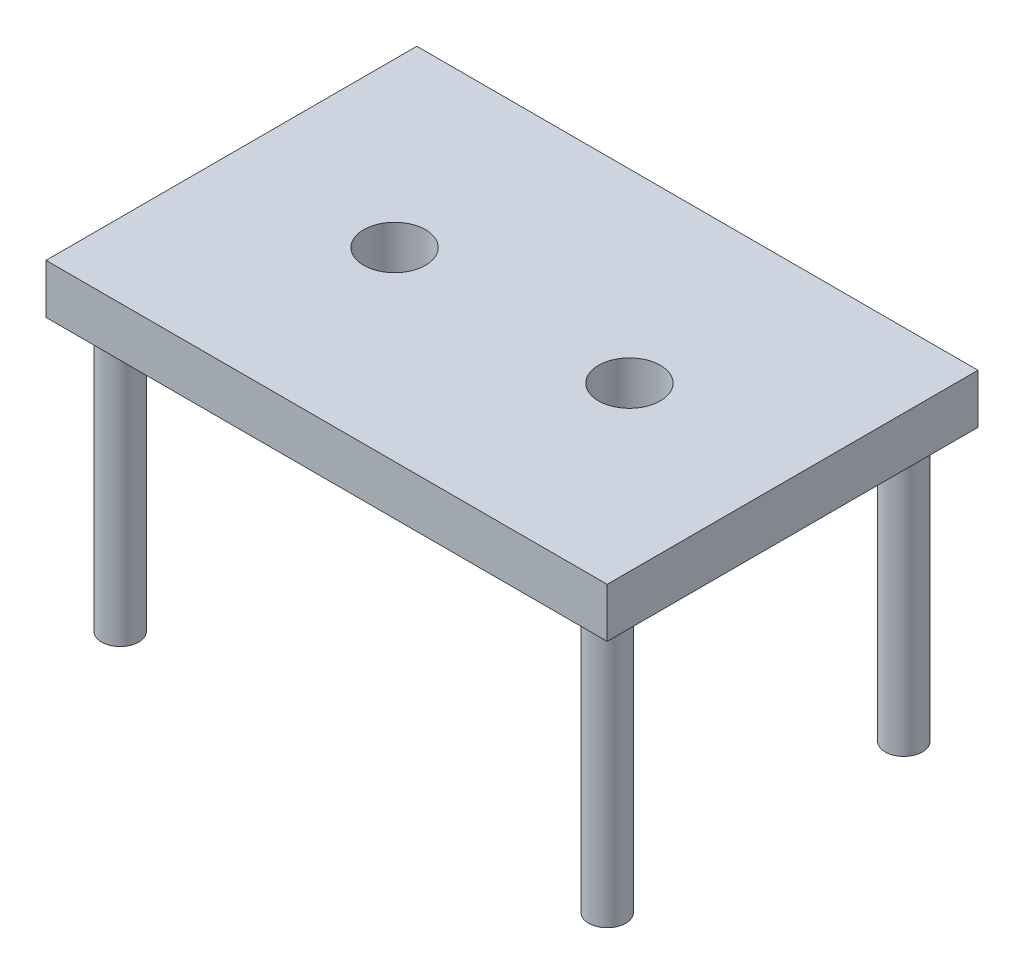
ISO-10303-21;
HEADER;
FILE_DESCRIPTION(('STEP AP214'),'2;1');
FILE_NAME('part.step','',(''),(''),'','','');
FILE_SCHEMA(('AUTOMOTIVE_DESIGN { 1 0 10303 214 1 1 1 1 }'));
ENDSEC;
DATA;
#1=APPLICATION_CONTEXT('core data for automotive mechanical design processes');
#2=APPLICATION_PROTOCOL_DEFINITION('international standard','automotive_design',2000,#1);
#3=PRODUCT_CONTEXT('',#1,'mechanical');
#4=PRODUCT('Part','Part','',(#3));
#5=PRODUCT_RELATED_PRODUCT_CATEGORY('part','',(#4));
#6=PRODUCT_DEFINITION_FORMATION('','',#4);
#7=PRODUCT_DEFINITION_CONTEXT('part definition',#1,'design');
#8=PRODUCT_DEFINITION('design','',#6,#7);
#9=PRODUCT_DEFINITION_SHAPE('','',#8);
#10=(LENGTH_UNIT() NAMED_UNIT(*) SI_UNIT(.MILLI.,.METRE.));
#11=(NAMED_UNIT(*) PLANE_ANGLE_UNIT() SI_UNIT($,.RADIAN.));
#12=(NAMED_UNIT(*) SI_UNIT($,.STERADIAN.) SOLID_ANGLE_UNIT());
#13=UNCERTAINTY_MEASURE_WITH_UNIT(LENGTH_MEASURE(1.E-05),#10,'distance_accuracy_value','');
#14=(GEOMETRIC_REPRESENTATION_CONTEXT(3) GLOBAL_UNCERTAINTY_ASSIGNED_CONTEXT((#13)) GLOBAL_UNIT_ASSIGNED_CONTEXT((#10,
#11,#12)) REPRESENTATION_CONTEXT('',''));
#15=CARTESIAN_POINT('',(0.,0.,0.));
#16=DIRECTION('',(0.,0.,1.));
#17=DIRECTION('',(1.,0.,0.));
#18=AXIS2_PLACEMENT_3D('',#15,#16,#17);
#19=CARTESIAN_POINT('',(0.,0.,0.));
#20=DIRECTION('',(0.,-1.,0.));
#21=DIRECTION('',(0.,0.,-1.));
#22=AXIS2_PLACEMENT_3D('',#19,#20,#21);
#23=PLANE('',#22);
#24=DIRECTION('',(1.,0.,0.));
#25=VECTOR('',#24,1.);
#26=CARTESIAN_POINT('',(-22.7,0.,15.));
#27=LINE('',#26,#25);
#28=CARTESIAN_POINT('',(19.7,0.,15.));
#29=VERTEX_POINT('',#28);
#30=CARTESIAN_POINT('',(22.7,0.,15.));
#31=VERTEX_POINT('',#30);
#32=EDGE_CURVE('E254',#29,#31,#27,.T.);
#33=ORIENTED_EDGE('',*,*,#32,.F.);
#34=CARTESIAN_POINT('',(19.7,0.,12.));
#35=DIRECTION('',(0.,-1.,0.));
#36=DIRECTION('',(0.,0.,-1.));
#37=AXIS2_PLACEMENT_3D('',#34,#35,#36);
#38=CIRCLE('',#37,3.);
#39=CARTESIAN_POINT('',(22.7,0.,12.));
#40=VERTEX_POINT('',#39);
#41=EDGE_CURVE('E160',#29,#40,#38,.F.);
#42=ORIENTED_EDGE('',*,*,#41,.T.);
#43=DIRECTION('',(0.,0.,-1.));
#44=VECTOR('',#43,1.);
#45=CARTESIAN_POINT('',(22.7,0.,15.));
#46=LINE('',#45,#44);
#47=EDGE_CURVE('E227',#31,#40,#46,.T.);
#48=ORIENTED_EDGE('',*,*,#47,.F.);
#49=EDGE_LOOP('',(#33,#42,#48));
#50=FACE_BOUND('',#49,.T.);
#51=ADVANCED_FACE('F45',(#50),#23,.T.);
#52=DIRECTION('',(0.,0.,1.));
#53=VECTOR('',#52,1.);
#54=CARTESIAN_POINT('',(-22.7,0.,15.));
#55=LINE('',#54,#53);
#56=CARTESIAN_POINT('',(-22.7,0.,12.));
#57=VERTEX_POINT('',#56);
#58=CARTESIAN_POINT('',(-22.7,0.,15.));
#59=VERTEX_POINT('',#58);
#60=EDGE_CURVE('E258',#57,#59,#55,.T.);
#61=ORIENTED_EDGE('',*,*,#60,.F.);
#62=CARTESIAN_POINT('',(-19.7,0.,12.));
#63=DIRECTION('',(0.,-1.,0.));
#64=DIRECTION('',(0.,0.,-1.));
#65=AXIS2_PLACEMENT_3D('',#62,#63,#64);
#66=CIRCLE('',#65,3.);
#67=CARTESIAN_POINT('',(-19.7,0.,15.));
#68=VERTEX_POINT('',#67);
#69=EDGE_CURVE('E155',#57,#68,#66,.F.);
#70=ORIENTED_EDGE('',*,*,#69,.T.);
#71=EDGE_CURVE('E131',#59,#68,#27,.T.);
#72=ORIENTED_EDGE('',*,*,#71,.F.);
#73=EDGE_LOOP('',(#61,#70,#72));
#74=FACE_BOUND('',#73,.T.);
#75=ADVANCED_FACE('F184',(#74),#23,.T.);
#76=DIRECTION('',(-1.,0.,0.));
#77=VECTOR('',#76,1.);
#78=CARTESIAN_POINT('',(-22.7,0.,-15.));
#79=LINE('',#78,#77);
#80=CARTESIAN_POINT('',(-19.7,0.,-15.));
#81=VERTEX_POINT('',#80);
#82=CARTESIAN_POINT('',(-22.7,0.,-15.));
#83=VERTEX_POINT('',#82);
#84=EDGE_CURVE('E231',#81,#83,#79,.T.);
#85=ORIENTED_EDGE('',*,*,#84,.F.);
#86=CARTESIAN_POINT('',(-19.7,0.,-12.));
#87=DIRECTION('',(0.,-1.,0.));
#88=DIRECTION('',(0.,0.,-1.));
#89=AXIS2_PLACEMENT_3D('',#86,#87,#88);
#90=CIRCLE('',#89,3.);
#91=CARTESIAN_POINT('',(-22.7,0.,-12.));
#92=VERTEX_POINT('',#91);
#93=EDGE_CURVE('E150',#81,#92,#90,.F.);
#94=ORIENTED_EDGE('',*,*,#93,.T.);
#95=EDGE_CURVE('E255',#83,#92,#55,.T.);
#96=ORIENTED_EDGE('',*,*,#95,.F.);
#97=EDGE_LOOP('',(#85,#94,#96));
#98=FACE_BOUND('',#97,.T.);
#99=ADVANCED_FACE('F191',(#98),#23,.T.);
#100=CARTESIAN_POINT('',(9.49999999999999,0.,0.));
#101=DIRECTION('',(0.,1.,0.));
#102=DIRECTION('',(0.,0.,1.));
#103=AXIS2_PLACEMENT_3D('',#100,#101,#102);
#104=CIRCLE('',#103,2.5);
#105=CARTESIAN_POINT('',(9.49999999999999,0.,2.5));
#106=VERTEX_POINT('',#105);
#107=EDGE_CURVE('E219',#106,#106,#104,.T.);
#108=ORIENTED_EDGE('',*,*,#107,.T.);
#109=EDGE_LOOP('',(#108));
#110=FACE_BOUND('',#109,.T.);
#111=CARTESIAN_POINT('',(-9.5,0.,0.));
#112=DIRECTION('',(0.,1.,0.));
#113=DIRECTION('',(0.,0.,1.));
#114=AXIS2_PLACEMENT_3D('',#111,#112,#113);
#115=CIRCLE('',#114,2.5);
#116=CARTESIAN_POINT('',(-9.5,0.,2.5));
#117=VERTEX_POINT('',#116);
#118=EDGE_CURVE('E222',#117,#117,#115,.T.);
#119=ORIENTED_EDGE('',*,*,#118,.T.);
#120=EDGE_LOOP('',(#119));
#121=FACE_BOUND('',#120,.T.);
#122=CARTESIAN_POINT('',(22.7,0.,-12.));
#123=VERTEX_POINT('',#122);
#124=EDGE_CURVE('E224',#40,#123,#46,.T.);
#125=ORIENTED_EDGE('',*,*,#124,.F.);
#126=CARTESIAN_POINT('',(19.7,0.,12.));
#127=DIRECTION('',(0.,-1.,0.));
#128=DIRECTION('',(0.,0.,-1.));
#129=AXIS2_PLACEMENT_3D('',#126,#127,#128);
#130=CIRCLE('',#129,3.);
#131=EDGE_CURVE('E158',#40,#29,#130,.F.);
#132=ORIENTED_EDGE('',*,*,#131,.T.);
#133=EDGE_CURVE('E253',#68,#29,#27,.T.);
#134=ORIENTED_EDGE('',*,*,#133,.F.);
#135=CARTESIAN_POINT('',(-19.7,0.,12.));
#136=DIRECTION('',(0.,-1.,0.));
#137=DIRECTION('',(0.,0.,-1.));
#138=AXIS2_PLACEMENT_3D('',#135,#136,#137);
#139=CIRCLE('',#138,3.);
#140=EDGE_CURVE('E153',#68,#57,#139,.F.);
#141=ORIENTED_EDGE('',*,*,#140,.T.);
#142=EDGE_CURVE('E257',#92,#57,#55,.T.);
#143=ORIENTED_EDGE('',*,*,#142,.F.);
#144=CARTESIAN_POINT('',(-19.7,0.,-12.));
#145=DIRECTION('',(0.,-1.,0.));
#146=DIRECTION('',(0.,0.,-1.));
#147=AXIS2_PLACEMENT_3D('',#144,#145,#146);
#148=CIRCLE('',#147,3.);
#149=EDGE_CURVE('E60',#92,#81,#148,.F.);
#150=ORIENTED_EDGE('',*,*,#149,.T.);
#151=CARTESIAN_POINT('',(19.7,0.,-15.));
#152=VERTEX_POINT('',#151);
#153=EDGE_CURVE('E232',#152,#81,#79,.T.);
#154=ORIENTED_EDGE('',*,*,#153,.F.);
#155=CARTESIAN_POINT('',(19.7,0.,-12.));
#156=DIRECTION('',(0.,-1.,0.));
#157=DIRECTION('',(0.,0.,-1.));
#158=AXIS2_PLACEMENT_3D('',#155,#156,#157);
#159=CIRCLE('',#158,3.);
#160=EDGE_CURVE('E146',#152,#123,#159,.F.);
#161=ORIENTED_EDGE('',*,*,#160,.T.);
#162=EDGE_LOOP('',(#125,#132,#134,#141,#143,#150,#154,#161));
#163=FACE_BOUND('',#162,.T.);
#164=ADVANCED_FACE('F198',(#110,#121,#163),#23,.T.);
#165=CARTESIAN_POINT('',(22.7,4.,15.));
#166=DIRECTION('',(-1.,0.,0.));
#167=DIRECTION('',(0.,0.,1.));
#168=AXIS2_PLACEMENT_3D('',#165,#166,#167);
#169=PLANE('',#168);
#170=ORIENTED_EDGE('',*,*,#47,.T.);
#171=ORIENTED_EDGE('',*,*,#124,.T.);
#172=CARTESIAN_POINT('',(22.7,0.,-15.));
#173=VERTEX_POINT('',#172);
#174=EDGE_CURVE('E136',#123,#173,#46,.T.);
#175=ORIENTED_EDGE('',*,*,#174,.T.);
#176=DIRECTION('',(0.,-1.,0.));
#177=VECTOR('',#176,1.);
#178=CARTESIAN_POINT('',(22.7,4.,-15.));
#179=LINE('',#178,#177);
#180=CARTESIAN_POINT('',(22.7,4.,-15.));
#181=VERTEX_POINT('',#180);
#182=EDGE_CURVE('E116',#181,#173,#179,.T.);
#183=ORIENTED_EDGE('',*,*,#182,.F.);
#184=DIRECTION('',(0.,0.,-1.));
#185=VECTOR('',#184,1.);
#186=CARTESIAN_POINT('',(22.7,4.,15.));
#187=LINE('',#186,#185);
#188=CARTESIAN_POINT('',(22.7,4.,15.));
#189=VERTEX_POINT('',#188);
#190=EDGE_CURVE('E122',#189,#181,#187,.T.);
#191=ORIENTED_EDGE('',*,*,#190,.F.);
#192=DIRECTION('',(0.,-1.,0.));
#193=VECTOR('',#192,1.);
#194=CARTESIAN_POINT('',(22.7,4.,15.));
#195=LINE('',#194,#193);
#196=EDGE_CURVE('E230',#189,#31,#195,.T.);
#197=ORIENTED_EDGE('',*,*,#196,.T.);
#198=EDGE_LOOP('',(#170,#171,#175,#183,#191,#197));
#199=FACE_BOUND('',#198,.T.);
#200=ADVANCED_FACE('F134',(#199),#169,.F.);
#201=CARTESIAN_POINT('',(-22.7,4.,-15.));
#202=DIRECTION('',(0.,0.,1.));
#203=DIRECTION('',(1.,0.,0.));
#204=AXIS2_PLACEMENT_3D('',#201,#202,#203);
#205=PLANE('',#204);
#206=EDGE_CURVE('E234',#173,#152,#79,.T.);
#207=ORIENTED_EDGE('',*,*,#206,.T.);
#208=ORIENTED_EDGE('',*,*,#153,.T.);
#209=ORIENTED_EDGE('',*,*,#84,.T.);
#210=DIRECTION('',(0.,-1.,0.));
#211=VECTOR('',#210,1.);
#212=CARTESIAN_POINT('',(-22.7,4.,-15.));
#213=LINE('',#212,#211);
#214=CARTESIAN_POINT('',(-22.7,4.,-15.));
#215=VERTEX_POINT('',#214);
#216=EDGE_CURVE('E118',#215,#83,#213,.T.);
#217=ORIENTED_EDGE('',*,*,#216,.F.);
#218=DIRECTION('',(-1.,0.,0.));
#219=VECTOR('',#218,1.);
#220=CARTESIAN_POINT('',(-22.7,4.,-15.));
#221=LINE('',#220,#219);
#222=EDGE_CURVE('E111',#181,#215,#221,.T.);
#223=ORIENTED_EDGE('',*,*,#222,.F.);
#224=ORIENTED_EDGE('',*,*,#182,.T.);
#225=EDGE_LOOP('',(#207,#208,#209,#217,#223,#224));
#226=FACE_BOUND('',#225,.T.);
#227=ADVANCED_FACE('F114',(#226),#205,.F.);
#228=CARTESIAN_POINT('',(-22.7,4.,15.));
#229=DIRECTION('',(1.,0.,0.));
#230=DIRECTION('',(0.,0.,-1.));
#231=AXIS2_PLACEMENT_3D('',#228,#229,#230);
#232=PLANE('',#231);
#233=ORIENTED_EDGE('',*,*,#95,.T.);
#234=ORIENTED_EDGE('',*,*,#142,.T.);
#235=ORIENTED_EDGE('',*,*,#60,.T.);
#236=DIRECTION('',(0.,-1.,0.));
#237=VECTOR('',#236,1.);
#238=CARTESIAN_POINT('',(-22.7,4.,15.));
#239=LINE('',#238,#237);
#240=CARTESIAN_POINT('',(-22.7,4.,15.));
#241=VERTEX_POINT('',#240);
#242=EDGE_CURVE('E141',#241,#59,#239,.T.);
#243=ORIENTED_EDGE('',*,*,#242,.F.);
#244=DIRECTION('',(0.,0.,1.));
#245=VECTOR('',#244,1.);
#246=CARTESIAN_POINT('',(-22.7,4.,15.));
#247=LINE('',#246,#245);
#248=EDGE_CURVE('E121',#215,#241,#247,.T.);
#249=ORIENTED_EDGE('',*,*,#248,.F.);
#250=ORIENTED_EDGE('',*,*,#216,.T.);
#251=EDGE_LOOP('',(#233,#234,#235,#243,#249,#250));
#252=FACE_BOUND('',#251,.T.);
#253=ADVANCED_FACE('F266',(#252),#232,.F.);
#254=CARTESIAN_POINT('',(-22.7,4.,15.));
#255=DIRECTION('',(0.,0.,-1.));
#256=DIRECTION('',(-1.,0.,0.));
#257=AXIS2_PLACEMENT_3D('',#254,#255,#256);
#258=PLANE('',#257);
#259=ORIENTED_EDGE('',*,*,#71,.T.);
#260=ORIENTED_EDGE('',*,*,#133,.T.);
#261=ORIENTED_EDGE('',*,*,#32,.T.);
#262=ORIENTED_EDGE('',*,*,#196,.F.);
#263=DIRECTION('',(1.,0.,0.));
#264=VECTOR('',#263,1.);
#265=CARTESIAN_POINT('',(-22.7,4.,15.));
#266=LINE('',#265,#264);
#267=EDGE_CURVE('E127',#241,#189,#266,.T.);
#268=ORIENTED_EDGE('',*,*,#267,.F.);
#269=ORIENTED_EDGE('',*,*,#242,.T.);
#270=EDGE_LOOP('',(#259,#260,#261,#262,#268,#269));
#271=FACE_BOUND('',#270,.T.);
#272=ADVANCED_FACE('F206',(#271),#258,.F.);
#273=CARTESIAN_POINT('',(0.,4.,0.));
#274=DIRECTION('',(0.,-1.,0.));
#275=DIRECTION('',(0.,0.,-1.));
#276=AXIS2_PLACEMENT_3D('',#273,#274,#275);
#277=PLANE('',#276);
#278=CARTESIAN_POINT('',(-9.5,4.,0.));
#279=DIRECTION('',(0.,1.,0.));
#280=DIRECTION('',(0.,0.,1.));
#281=AXIS2_PLACEMENT_3D('',#278,#279,#280);
#282=CIRCLE('',#281,2.5);
#283=CARTESIAN_POINT('',(-9.5,4.,2.5));
#284=VERTEX_POINT('',#283);
#285=EDGE_CURVE('E236',#284,#284,#282,.T.);
#286=ORIENTED_EDGE('',*,*,#285,.F.);
#287=EDGE_LOOP('',(#286));
#288=FACE_BOUND('',#287,.T.);
#289=CARTESIAN_POINT('',(9.49999999999999,4.,0.));
#290=DIRECTION('',(0.,1.,0.));
#291=DIRECTION('',(0.,0.,1.));
#292=AXIS2_PLACEMENT_3D('',#289,#290,#291);
#293=CIRCLE('',#292,2.5);
#294=CARTESIAN_POINT('',(9.49999999999999,4.,2.5));
#295=VERTEX_POINT('',#294);
#296=EDGE_CURVE('E239',#295,#295,#293,.T.);
#297=ORIENTED_EDGE('',*,*,#296,.F.);
#298=EDGE_LOOP('',(#297));
#299=FACE_BOUND('',#298,.T.);
#300=ORIENTED_EDGE('',*,*,#190,.T.);
#301=ORIENTED_EDGE('',*,*,#222,.T.);
#302=ORIENTED_EDGE('',*,*,#248,.T.);
#303=ORIENTED_EDGE('',*,*,#267,.T.);
#304=EDGE_LOOP('',(#300,#301,#302,#303));
#305=FACE_BOUND('',#304,.T.);
#306=ADVANCED_FACE('F125',(#288,#299,#305),#277,.F.);
#307=ORIENTED_EDGE('',*,*,#174,.F.);
#308=CARTESIAN_POINT('',(19.7,0.,-12.));
#309=DIRECTION('',(0.,-1.,0.));
#310=DIRECTION('',(0.,0.,-1.));
#311=AXIS2_PLACEMENT_3D('',#308,#309,#310);
#312=CIRCLE('',#311,3.);
#313=EDGE_CURVE('E68',#123,#152,#312,.F.);
#314=ORIENTED_EDGE('',*,*,#313,.T.);
#315=ORIENTED_EDGE('',*,*,#206,.F.);
#316=EDGE_LOOP('',(#307,#314,#315));
#317=FACE_BOUND('',#316,.T.);
#318=ADVANCED_FACE('F187',(#317),#23,.T.);
#319=CARTESIAN_POINT('',(9.49999999999999,0.,0.));
#320=DIRECTION('',(0.,1.,0.));
#321=DIRECTION('',(0.,0.,1.));
#322=AXIS2_PLACEMENT_3D('',#319,#320,#321);
#323=CYLINDRICAL_SURFACE('',#322,2.5);
#324=ORIENTED_EDGE('',*,*,#107,.F.);
#325=EDGE_LOOP('',(#324));
#326=FACE_BOUND('',#325,.T.);
#327=ORIENTED_EDGE('',*,*,#296,.T.);
#328=EDGE_LOOP('',(#327));
#329=FACE_BOUND('',#328,.T.);
#330=ADVANCED_FACE('F197',(#326,#329),#323,.F.);
#331=CARTESIAN_POINT('',(-9.5,0.,0.));
#332=DIRECTION('',(0.,1.,0.));
#333=DIRECTION('',(0.,0.,1.));
#334=AXIS2_PLACEMENT_3D('',#331,#332,#333);
#335=CYLINDRICAL_SURFACE('',#334,2.5);
#336=ORIENTED_EDGE('',*,*,#118,.F.);
#337=EDGE_LOOP('',(#336));
#338=FACE_BOUND('',#337,.T.);
#339=ORIENTED_EDGE('',*,*,#285,.T.);
#340=EDGE_LOOP('',(#339));
#341=FACE_BOUND('',#340,.T.);
#342=ADVANCED_FACE('F203',(#338,#341),#335,.F.);
#343=CARTESIAN_POINT('',(-19.7,-22.,12.));
#344=DIRECTION('',(0.,1.,0.));
#345=DIRECTION('',(0.,0.,1.));
#346=AXIS2_PLACEMENT_3D('',#343,#344,#345);
#347=CYLINDRICAL_SURFACE('',#346,1.5);
#348=CARTESIAN_POINT('',(-19.7,-1.5,12.));
#349=DIRECTION('',(0.,-1.,0.));
#350=DIRECTION('',(0.,0.,-1.));
#351=AXIS2_PLACEMENT_3D('',#348,#349,#350);
#352=CIRCLE('',#351,1.5);
#353=CARTESIAN_POINT('',(-19.7,-1.5,10.5));
#354=VERTEX_POINT('',#353);
#355=EDGE_CURVE('E163',#354,#354,#352,.T.);
#356=ORIENTED_EDGE('',*,*,#355,.T.);
#357=EDGE_LOOP('',(#356));
#358=FACE_BOUND('',#357,.T.);
#359=CARTESIAN_POINT('',(-19.7,-22.,12.));
#360=DIRECTION('',(0.,-1.,0.));
#361=DIRECTION('',(0.,0.,-1.));
#362=AXIS2_PLACEMENT_3D('',#359,#360,#361);
#363=CIRCLE('',#362,1.5);
#364=CARTESIAN_POINT('',(-19.7,-22.,10.5));
#365=VERTEX_POINT('',#364);
#366=EDGE_CURVE('E242',#365,#365,#363,.T.);
#367=ORIENTED_EDGE('',*,*,#366,.F.);
#368=EDGE_LOOP('',(#367));
#369=FACE_BOUND('',#368,.T.);
#370=ADVANCED_FACE('F318',(#358,#369),#347,.T.);
#371=CARTESIAN_POINT('',(-19.7,-22.,12.));
#372=DIRECTION('',(0.,-1.,0.));
#373=DIRECTION('',(0.,0.,-1.));
#374=AXIS2_PLACEMENT_3D('',#371,#372,#373);
#375=PLANE('',#374);
#376=ORIENTED_EDGE('',*,*,#366,.T.);
#377=EDGE_LOOP('',(#376));
#378=FACE_BOUND('',#377,.T.);
#379=ADVANCED_FACE('F283',(#378),#375,.T.);
#380=CARTESIAN_POINT('',(19.7,-22.,12.));
#381=DIRECTION('',(0.,1.,0.));
#382=DIRECTION('',(0.,0.,1.));
#383=AXIS2_PLACEMENT_3D('',#380,#381,#382);
#384=CYLINDRICAL_SURFACE('',#383,1.5);
#385=CARTESIAN_POINT('',(19.7,-1.5,12.));
#386=DIRECTION('',(0.,-1.,0.));
#387=DIRECTION('',(0.,0.,-1.));
#388=AXIS2_PLACEMENT_3D('',#385,#386,#387);
#389=CIRCLE('',#388,1.5);
#390=CARTESIAN_POINT('',(19.7,-1.5,10.5));
#391=VERTEX_POINT('',#390);
#392=EDGE_CURVE('E137',#391,#391,#389,.T.);
#393=ORIENTED_EDGE('',*,*,#392,.T.);
#394=EDGE_LOOP('',(#393));
#395=FACE_BOUND('',#394,.T.);
#396=CARTESIAN_POINT('',(19.7,-22.,12.));
#397=DIRECTION('',(0.,-1.,0.));
#398=DIRECTION('',(0.,0.,-1.));
#399=AXIS2_PLACEMENT_3D('',#396,#397,#398);
#400=CIRCLE('',#399,1.5);
#401=CARTESIAN_POINT('',(19.7,-22.,10.5));
#402=VERTEX_POINT('',#401);
#403=EDGE_CURVE('E287',#402,#402,#400,.T.);
#404=ORIENTED_EDGE('',*,*,#403,.F.);
#405=EDGE_LOOP('',(#404));
#406=FACE_BOUND('',#405,.T.);
#407=ADVANCED_FACE('F279',(#395,#406),#384,.T.);
#408=CARTESIAN_POINT('',(19.7,-22.,12.));
#409=DIRECTION('',(0.,-1.,0.));
#410=DIRECTION('',(0.,0.,-1.));
#411=AXIS2_PLACEMENT_3D('',#408,#409,#410);
#412=PLANE('',#411);
#413=ORIENTED_EDGE('',*,*,#403,.T.);
#414=EDGE_LOOP('',(#413));
#415=FACE_BOUND('',#414,.T.);
#416=ADVANCED_FACE('F282',(#415),#412,.T.);
#417=CARTESIAN_POINT('',(-19.7,-22.,-12.));
#418=DIRECTION('',(0.,1.,0.));
#419=DIRECTION('',(0.,0.,1.));
#420=AXIS2_PLACEMENT_3D('',#417,#418,#419);
#421=CYLINDRICAL_SURFACE('',#420,1.5);
#422=CARTESIAN_POINT('',(-19.7,-1.5,-12.));
#423=DIRECTION('',(0.,-1.,0.));
#424=DIRECTION('',(0.,0.,-1.));
#425=AXIS2_PLACEMENT_3D('',#422,#423,#424);
#426=CIRCLE('',#425,1.5);
#427=CARTESIAN_POINT('',(-19.7,-1.5,-13.5));
#428=VERTEX_POINT('',#427);
#429=EDGE_CURVE('E53',#428,#428,#426,.T.);
#430=ORIENTED_EDGE('',*,*,#429,.T.);
#431=EDGE_LOOP('',(#430));
#432=FACE_BOUND('',#431,.T.);
#433=CARTESIAN_POINT('',(-19.7,-22.,-12.));
#434=DIRECTION('',(0.,-1.,0.));
#435=DIRECTION('',(0.,0.,-1.));
#436=AXIS2_PLACEMENT_3D('',#433,#434,#435);
#437=CIRCLE('',#436,1.5);
#438=CARTESIAN_POINT('',(-19.7,-22.,-13.5));
#439=VERTEX_POINT('',#438);
#440=EDGE_CURVE('E289',#439,#439,#437,.T.);
#441=ORIENTED_EDGE('',*,*,#440,.F.);
#442=EDGE_LOOP('',(#441));
#443=FACE_BOUND('',#442,.T.);
#444=ADVANCED_FACE('F168',(#432,#443),#421,.T.);
#445=CARTESIAN_POINT('',(-19.7,-22.,-12.));
#446=DIRECTION('',(0.,-1.,0.));
#447=DIRECTION('',(0.,0.,-1.));
#448=AXIS2_PLACEMENT_3D('',#445,#446,#447);
#449=PLANE('',#448);
#450=ORIENTED_EDGE('',*,*,#440,.T.);
#451=EDGE_LOOP('',(#450));
#452=FACE_BOUND('',#451,.T.);
#453=ADVANCED_FACE('F301',(#452),#449,.T.);
#454=CARTESIAN_POINT('',(19.7,-22.,-12.));
#455=DIRECTION('',(0.,1.,0.));
#456=DIRECTION('',(0.,0.,1.));
#457=AXIS2_PLACEMENT_3D('',#454,#455,#456);
#458=CYLINDRICAL_SURFACE('',#457,1.5);
#459=CARTESIAN_POINT('',(19.7,-1.5,-12.));
#460=DIRECTION('',(0.,-1.,0.));
#461=DIRECTION('',(0.,0.,-1.));
#462=AXIS2_PLACEMENT_3D('',#459,#460,#461);
#463=CIRCLE('',#462,1.5);
#464=CARTESIAN_POINT('',(19.7,-1.5,-13.5));
#465=VERTEX_POINT('',#464);
#466=EDGE_CURVE('E11',#465,#465,#463,.T.);
#467=ORIENTED_EDGE('',*,*,#466,.T.);
#468=EDGE_LOOP('',(#467));
#469=FACE_BOUND('',#468,.T.);
#470=CARTESIAN_POINT('',(19.7,-22.,-12.));
#471=DIRECTION('',(0.,-1.,0.));
#472=DIRECTION('',(0.,0.,-1.));
#473=AXIS2_PLACEMENT_3D('',#470,#471,#472);
#474=CIRCLE('',#473,1.5);
#475=CARTESIAN_POINT('',(19.7,-22.,-13.5));
#476=VERTEX_POINT('',#475);
#477=EDGE_CURVE('E292',#476,#476,#474,.T.);
#478=ORIENTED_EDGE('',*,*,#477,.F.);
#479=EDGE_LOOP('',(#478));
#480=FACE_BOUND('',#479,.T.);
#481=ADVANCED_FACE('F299',(#469,#480),#458,.T.);
#482=CARTESIAN_POINT('',(19.7,-22.,-12.));
#483=DIRECTION('',(0.,-1.,0.));
#484=DIRECTION('',(0.,0.,-1.));
#485=AXIS2_PLACEMENT_3D('',#482,#483,#484);
#486=PLANE('',#485);
#487=ORIENTED_EDGE('',*,*,#477,.T.);
#488=EDGE_LOOP('',(#487));
#489=FACE_BOUND('',#488,.T.);
#490=ADVANCED_FACE('F275',(#489),#486,.T.);
#491=CARTESIAN_POINT('',(19.7,-1.5,12.));
#492=DIRECTION('',(0.,-1.,0.));
#493=DIRECTION('',(0.,0.,-1.));
#494=AXIS2_PLACEMENT_3D('',#491,#492,#493);
#495=TOROIDAL_SURFACE('',#494,3.,1.5);
#496=ORIENTED_EDGE('',*,*,#131,.F.);
#497=ORIENTED_EDGE('',*,*,#41,.F.);
#498=EDGE_LOOP('',(#496,#497));
#499=FACE_BOUND('',#498,.T.);
#500=ORIENTED_EDGE('',*,*,#392,.F.);
#501=EDGE_LOOP('',(#500));
#502=FACE_BOUND('',#501,.T.);
#503=ADVANCED_FACE('F180',(#499,#502),#495,.F.);
#504=CARTESIAN_POINT('',(-19.7,-1.5,12.));
#505=DIRECTION('',(0.,-1.,0.));
#506=DIRECTION('',(0.,0.,-1.));
#507=AXIS2_PLACEMENT_3D('',#504,#505,#506);
#508=TOROIDAL_SURFACE('',#507,3.,1.5);
#509=ORIENTED_EDGE('',*,*,#140,.F.);
#510=ORIENTED_EDGE('',*,*,#69,.F.);
#511=EDGE_LOOP('',(#509,#510));
#512=FACE_BOUND('',#511,.T.);
#513=ORIENTED_EDGE('',*,*,#355,.F.);
#514=EDGE_LOOP('',(#513));
#515=FACE_BOUND('',#514,.T.);
#516=ADVANCED_FACE('F173',(#512,#515),#508,.F.);
#517=CARTESIAN_POINT('',(-19.7,-1.5,-12.));
#518=DIRECTION('',(0.,-1.,0.));
#519=DIRECTION('',(0.,0.,-1.));
#520=AXIS2_PLACEMENT_3D('',#517,#518,#519);
#521=TOROIDAL_SURFACE('',#520,3.,1.5);
#522=ORIENTED_EDGE('',*,*,#149,.F.);
#523=ORIENTED_EDGE('',*,*,#93,.F.);
#524=EDGE_LOOP('',(#522,#523));
#525=FACE_BOUND('',#524,.T.);
#526=ORIENTED_EDGE('',*,*,#429,.F.);
#527=EDGE_LOOP('',(#526));
#528=FACE_BOUND('',#527,.T.);
#529=ADVANCED_FACE('F171',(#525,#528),#521,.F.);
#530=CARTESIAN_POINT('',(19.7,-1.5,-12.));
#531=DIRECTION('',(0.,-1.,0.));
#532=DIRECTION('',(0.,0.,-1.));
#533=AXIS2_PLACEMENT_3D('',#530,#531,#532);
#534=TOROIDAL_SURFACE('',#533,3.,1.5);
#535=ORIENTED_EDGE('',*,*,#313,.F.);
#536=ORIENTED_EDGE('',*,*,#160,.F.);
#537=EDGE_LOOP('',(#535,#536));
#538=FACE_BOUND('',#537,.T.);
#539=ORIENTED_EDGE('',*,*,#466,.F.);
#540=EDGE_LOOP('',(#539));
#541=FACE_BOUND('',#540,.T.);
#542=ADVANCED_FACE('F47',(#538,#541),#534,.F.);
#543=CLOSED_SHELL('',(#51,#75,#99,#164,#200,#227,#253,#272,#306,#318,#330,#342,#370,#379,#407,
#416,#444,#453,#481,#490,#503,#516,#529,#542));
#544=MANIFOLD_SOLID_BREP('B2',#543);
#545=ADVANCED_BREP_SHAPE_REPRESENTATION('',(#18,#544),#14);
#546=SHAPE_DEFINITION_REPRESENTATION(#9,#545);
ENDSEC;
END-ISO-10303-21;
